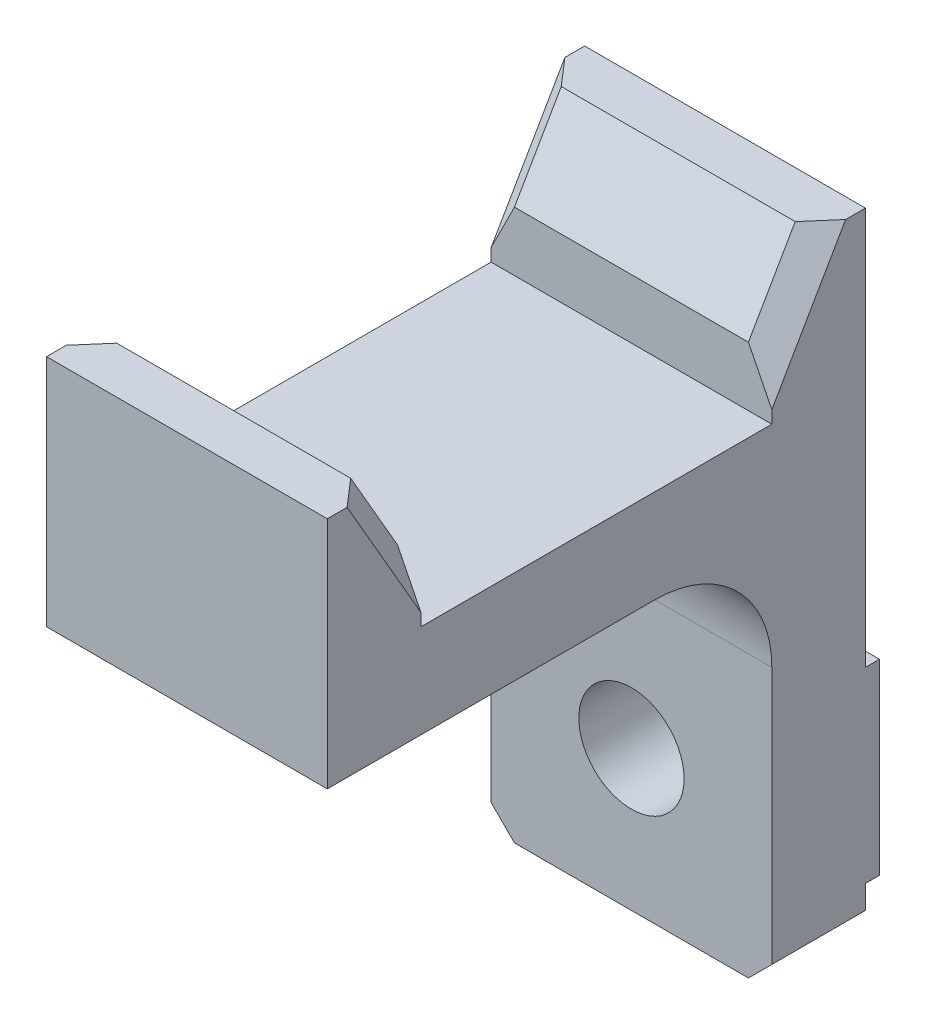
ISO-10303-21;
HEADER;
FILE_DESCRIPTION(('STEP AP214'),'2;1');
FILE_NAME('part.step','',(''),(''),'','','');
FILE_SCHEMA(('AUTOMOTIVE_DESIGN { 1 0 10303 214 1 1 1 1 }'));
ENDSEC;
DATA;
#1=APPLICATION_CONTEXT('core data for automotive mechanical design processes');
#2=APPLICATION_PROTOCOL_DEFINITION('international standard','automotive_design',2000,#1);
#3=PRODUCT_CONTEXT('',#1,'mechanical');
#4=PRODUCT('Part','Part','',(#3));
#5=PRODUCT_RELATED_PRODUCT_CATEGORY('part','',(#4));
#6=PRODUCT_DEFINITION_FORMATION('','',#4);
#7=PRODUCT_DEFINITION_CONTEXT('part definition',#1,'design');
#8=PRODUCT_DEFINITION('design','',#6,#7);
#9=PRODUCT_DEFINITION_SHAPE('','',#8);
#10=(LENGTH_UNIT() NAMED_UNIT(*) SI_UNIT(.MILLI.,.METRE.));
#11=(NAMED_UNIT(*) PLANE_ANGLE_UNIT() SI_UNIT($,.RADIAN.));
#12=(NAMED_UNIT(*) SI_UNIT($,.STERADIAN.) SOLID_ANGLE_UNIT());
#13=UNCERTAINTY_MEASURE_WITH_UNIT(LENGTH_MEASURE(1.E-05),#10,'distance_accuracy_value','');
#14=(GEOMETRIC_REPRESENTATION_CONTEXT(3) GLOBAL_UNCERTAINTY_ASSIGNED_CONTEXT((#13)) GLOBAL_UNIT_ASSIGNED_CONTEXT((#10,
#11,#12)) REPRESENTATION_CONTEXT('',''));
#15=CARTESIAN_POINT('',(0.,0.,0.));
#16=DIRECTION('',(0.,0.,1.));
#17=DIRECTION('',(1.,0.,0.));
#18=AXIS2_PLACEMENT_3D('',#15,#16,#17);
#19=CARTESIAN_POINT('',(6.,0.,7.5));
#20=DIRECTION('',(0.,0.,1.));
#21=DIRECTION('',(1.,0.,0.));
#22=AXIS2_PLACEMENT_3D('',#19,#20,#21);
#23=PLANE('',#22);
#24=DIRECTION('',(0.,1.,0.));
#25=VECTOR('',#24,1.);
#26=CARTESIAN_POINT('',(-6.,0.,7.5));
#27=LINE('',#26,#25);
#28=CARTESIAN_POINT('',(-6.,0.,7.5));
#29=VERTEX_POINT('',#28);
#30=CARTESIAN_POINT('',(-6.,0.535898384862258,7.5));
#31=VERTEX_POINT('',#30);
#32=EDGE_CURVE('E240',#29,#31,#27,.T.);
#33=ORIENTED_EDGE('',*,*,#32,.T.);
#34=DIRECTION('',(0.447213595499961,0.894427190999914,0.));
#35=VECTOR('',#34,1.);
#36=CARTESIAN_POINT('',(-7.45980762113535,-2.3837168574084,7.5));
#37=LINE('',#36,#35);
#38=CARTESIAN_POINT('',(-5.,2.53589838486225,7.5));
#39=VERTEX_POINT('',#38);
#40=EDGE_CURVE('E313',#31,#39,#37,.T.);
#41=ORIENTED_EDGE('',*,*,#40,.T.);
#42=DIRECTION('',(1.,0.,0.));
#43=VECTOR('',#42,1.);
#44=CARTESIAN_POINT('',(6.,2.53589838486225,7.5));
#45=LINE('',#44,#43);
#46=CARTESIAN_POINT('',(4.99999999999999,2.53589838486225,7.5));
#47=VERTEX_POINT('',#46);
#48=EDGE_CURVE('E296',#39,#47,#45,.T.);
#49=ORIENTED_EDGE('',*,*,#48,.T.);
#50=DIRECTION('',(-0.447213595499961,0.894427190999915,0.));
#51=VECTOR('',#50,1.);
#52=CARTESIAN_POINT('',(7.45980762113534,-2.38371685740841,7.5));
#53=LINE('',#52,#51);
#54=CARTESIAN_POINT('',(6.,0.53589838486224,7.5));
#55=VERTEX_POINT('',#54);
#56=EDGE_CURVE('E311',#47,#55,#53,.F.);
#57=ORIENTED_EDGE('',*,*,#56,.T.);
#58=DIRECTION('',(0.,1.,0.));
#59=VECTOR('',#58,1.);
#60=CARTESIAN_POINT('',(6.,0.,7.5));
#61=LINE('',#60,#59);
#62=CARTESIAN_POINT('',(6.,0.,7.5));
#63=VERTEX_POINT('',#62);
#64=EDGE_CURVE('E200',#63,#55,#61,.T.);
#65=ORIENTED_EDGE('',*,*,#64,.F.);
#66=DIRECTION('',(-1.,0.,0.));
#67=VECTOR('',#66,1.);
#68=CARTESIAN_POINT('',(6.,0.,7.5));
#69=LINE('',#68,#67);
#70=EDGE_CURVE('E239',#63,#29,#69,.T.);
#71=ORIENTED_EDGE('',*,*,#70,.T.);
#72=EDGE_LOOP('',(#33,#41,#49,#57,#65,#71));
#73=FACE_BOUND('',#72,.T.);
#74=ADVANCED_FACE('F35',(#73),#23,.F.);
#75=CARTESIAN_POINT('',(6.,6.,11.5));
#76=DIRECTION('',(0.,-1.,0.));
#77=DIRECTION('',(0.,0.,-1.));
#78=AXIS2_PLACEMENT_3D('',#75,#76,#77);
#79=PLANE('',#78);
#80=DIRECTION('',(-1.,0.,0.));
#81=VECTOR('',#80,1.);
#82=CARTESIAN_POINT('',(6.,6.,9.5));
#83=LINE('',#82,#81);
#84=CARTESIAN_POINT('',(4.99999999999999,6.,9.5));
#85=VERTEX_POINT('',#84);
#86=CARTESIAN_POINT('',(-5.,6.,9.5));
#87=VERTEX_POINT('',#86);
#88=EDGE_CURVE('E210',#85,#87,#83,.T.);
#89=ORIENTED_EDGE('',*,*,#88,.T.);
#90=DIRECTION('',(-0.65465367070798,0.,0.755928946018452));
#91=VECTOR('',#90,1.);
#92=CARTESIAN_POINT('',(-3.39610838057825,6.,7.64798548355176));
#93=LINE('',#92,#91);
#94=CARTESIAN_POINT('',(-6.,6.,10.6547005383793));
#95=VERTEX_POINT('',#94);
#96=EDGE_CURVE('E321',#87,#95,#93,.T.);
#97=ORIENTED_EDGE('',*,*,#96,.T.);
#98=DIRECTION('',(0.,0.,1.));
#99=VECTOR('',#98,1.);
#100=CARTESIAN_POINT('',(-6.,6.,11.5));
#101=LINE('',#100,#99);
#102=CARTESIAN_POINT('',(-6.,6.,11.5));
#103=VERTEX_POINT('',#102);
#104=EDGE_CURVE('E207',#95,#103,#101,.T.);
#105=ORIENTED_EDGE('',*,*,#104,.T.);
#106=DIRECTION('',(-1.,0.,0.));
#107=VECTOR('',#106,1.);
#108=CARTESIAN_POINT('',(6.,6.,11.5));
#109=LINE('',#108,#107);
#110=CARTESIAN_POINT('',(6.,6.,11.5));
#111=VERTEX_POINT('',#110);
#112=EDGE_CURVE('E203',#111,#103,#109,.T.);
#113=ORIENTED_EDGE('',*,*,#112,.F.);
#114=DIRECTION('',(0.,0.,1.));
#115=VECTOR('',#114,1.);
#116=CARTESIAN_POINT('',(6.,6.,11.5));
#117=LINE('',#116,#115);
#118=CARTESIAN_POINT('',(6.,6.,10.6547005383793));
#119=VERTEX_POINT('',#118);
#120=EDGE_CURVE('E190',#119,#111,#117,.T.);
#121=ORIENTED_EDGE('',*,*,#120,.F.);
#122=DIRECTION('',(0.654653670707979,0.,0.755928946018453));
#123=VECTOR('',#122,1.);
#124=CARTESIAN_POINT('',(3.39610838057825,6.,7.64798548355176));
#125=LINE('',#124,#123);
#126=EDGE_CURVE('E319',#119,#85,#125,.F.);
#127=ORIENTED_EDGE('',*,*,#126,.T.);
#128=EDGE_LOOP('',(#89,#97,#105,#113,#121,#127));
#129=FACE_BOUND('',#128,.T.);
#130=ADVANCED_FACE('F205',(#129),#79,.F.);
#131=CARTESIAN_POINT('',(6.,6.,11.5));
#132=DIRECTION('',(0.,0.,-1.));
#133=DIRECTION('',(0.,1.,0.));
#134=AXIS2_PLACEMENT_3D('',#131,#132,#133);
#135=PLANE('',#134);
#136=DIRECTION('',(0.,-1.,0.));
#137=VECTOR('',#136,1.);
#138=CARTESIAN_POINT('',(-6.,6.,11.5));
#139=LINE('',#138,#137);
#140=CARTESIAN_POINT('',(-6.,-4.,11.5));
#141=VERTEX_POINT('',#140);
#142=EDGE_CURVE('E245',#103,#141,#139,.T.);
#143=ORIENTED_EDGE('',*,*,#142,.T.);
#144=DIRECTION('',(-1.,0.,0.));
#145=VECTOR('',#144,1.);
#146=CARTESIAN_POINT('',(6.,-4.,11.5));
#147=LINE('',#146,#145);
#148=CARTESIAN_POINT('',(6.,-4.,11.5));
#149=VERTEX_POINT('',#148);
#150=EDGE_CURVE('E211',#149,#141,#147,.T.);
#151=ORIENTED_EDGE('',*,*,#150,.F.);
#152=DIRECTION('',(0.,-1.,0.));
#153=VECTOR('',#152,1.);
#154=CARTESIAN_POINT('',(6.,6.,11.5));
#155=LINE('',#154,#153);
#156=EDGE_CURVE('E194',#111,#149,#155,.T.);
#157=ORIENTED_EDGE('',*,*,#156,.F.);
#158=ORIENTED_EDGE('',*,*,#112,.T.);
#159=EDGE_LOOP('',(#143,#151,#157,#158));
#160=FACE_BOUND('',#159,.T.);
#161=ADVANCED_FACE('F213',(#160),#135,.F.);
#162=CARTESIAN_POINT('',(6.,-4.,11.5));
#163=DIRECTION('',(0.,1.,0.));
#164=DIRECTION('',(0.,0.,1.));
#165=AXIS2_PLACEMENT_3D('',#162,#163,#164);
#166=PLANE('',#165);
#167=DIRECTION('',(0.,0.,-1.));
#168=VECTOR('',#167,1.);
#169=CARTESIAN_POINT('',(-6.,-4.,11.5));
#170=LINE('',#169,#168);
#171=CARTESIAN_POINT('',(-6.,-4.,-2.5));
#172=VERTEX_POINT('',#171);
#173=EDGE_CURVE('E247',#141,#172,#170,.T.);
#174=ORIENTED_EDGE('',*,*,#173,.T.);
#175=DIRECTION('',(-1.,0.,0.));
#176=VECTOR('',#175,1.);
#177=CARTESIAN_POINT('',(6.,-4.,-2.5));
#178=LINE('',#177,#176);
#179=CARTESIAN_POINT('',(6.,-4.,-2.5));
#180=VERTEX_POINT('',#179);
#181=EDGE_CURVE('E50',#172,#180,#178,.F.);
#182=ORIENTED_EDGE('',*,*,#181,.T.);
#183=DIRECTION('',(0.,0.,-1.));
#184=VECTOR('',#183,1.);
#185=CARTESIAN_POINT('',(6.,-4.,11.5));
#186=LINE('',#185,#184);
#187=EDGE_CURVE('E215',#149,#180,#186,.T.);
#188=ORIENTED_EDGE('',*,*,#187,.F.);
#189=ORIENTED_EDGE('',*,*,#150,.T.);
#190=EDGE_LOOP('',(#174,#182,#188,#189));
#191=FACE_BOUND('',#190,.T.);
#192=ADVANCED_FACE('F455',(#191),#166,.F.);
#193=CARTESIAN_POINT('',(6.,-4.,-7.5));
#194=DIRECTION('',(0.,0.,-1.));
#195=DIRECTION('',(0.,1.,0.));
#196=AXIS2_PLACEMENT_3D('',#193,#194,#195);
#197=PLANE('',#196);
#198=CARTESIAN_POINT('',(0.,-15.,-7.5));
#199=DIRECTION('',(0.,0.,1.));
#200=DIRECTION('',(1.,0.,0.));
#201=AXIS2_PLACEMENT_3D('',#198,#199,#200);
#202=CIRCLE('',#201,2.25);
#203=CARTESIAN_POINT('',(2.25,-15.,-7.5));
#204=VERTEX_POINT('',#203);
#205=EDGE_CURVE('E440',#204,#204,#202,.T.);
#206=ORIENTED_EDGE('',*,*,#205,.F.);
#207=EDGE_LOOP('',(#206));
#208=FACE_BOUND('',#207,.T.);
#209=DIRECTION('',(0.,-1.,0.));
#210=VECTOR('',#209,1.);
#211=CARTESIAN_POINT('',(6.,-4.,-7.5));
#212=LINE('',#211,#210);
#213=CARTESIAN_POINT('',(6.,-9.,-7.5));
#214=VERTEX_POINT('',#213);
#215=CARTESIAN_POINT('',(6.,-20.,-7.5));
#216=VERTEX_POINT('',#215);
#217=EDGE_CURVE('E217',#214,#216,#212,.T.);
#218=ORIENTED_EDGE('',*,*,#217,.F.);
#219=DIRECTION('',(-1.,0.,0.));
#220=VECTOR('',#219,1.);
#221=CARTESIAN_POINT('',(-6.,-9.,-7.5));
#222=LINE('',#221,#220);
#223=CARTESIAN_POINT('',(-6.,-9.,-7.5));
#224=VERTEX_POINT('',#223);
#225=EDGE_CURVE('E359',#214,#224,#222,.T.);
#226=ORIENTED_EDGE('',*,*,#225,.T.);
#227=DIRECTION('',(0.,-1.,0.));
#228=VECTOR('',#227,1.);
#229=CARTESIAN_POINT('',(-6.,-4.,-7.5));
#230=LINE('',#229,#228);
#231=CARTESIAN_POINT('',(-6.,-20.,-7.5));
#232=VERTEX_POINT('',#231);
#233=EDGE_CURVE('E249',#224,#232,#230,.T.);
#234=ORIENTED_EDGE('',*,*,#233,.T.);
#235=DIRECTION('',(0.707106781186545,-0.70710678118655,0.));
#236=VECTOR('',#235,1.);
#237=CARTESIAN_POINT('',(-5.,-21.,-7.5));
#238=LINE('',#237,#236);
#239=CARTESIAN_POINT('',(-5.00000000000001,-21.,-7.5));
#240=VERTEX_POINT('',#239);
#241=EDGE_CURVE('E354',#232,#240,#238,.T.);
#242=ORIENTED_EDGE('',*,*,#241,.T.);
#243=DIRECTION('',(-1.,0.,0.));
#244=VECTOR('',#243,1.);
#245=CARTESIAN_POINT('',(6.,-21.,-7.5));
#246=LINE('',#245,#244);
#247=CARTESIAN_POINT('',(5.00000000000001,-21.,-7.5));
#248=VERTEX_POINT('',#247);
#249=EDGE_CURVE('E291',#248,#240,#246,.T.);
#250=ORIENTED_EDGE('',*,*,#249,.F.);
#251=DIRECTION('',(-0.707106781186547,-0.707106781186548,0.));
#252=VECTOR('',#251,1.);
#253=CARTESIAN_POINT('',(6.,-20.,-7.5));
#254=LINE('',#253,#252);
#255=EDGE_CURVE('E351',#248,#216,#254,.F.);
#256=ORIENTED_EDGE('',*,*,#255,.T.);
#257=EDGE_LOOP('',(#218,#226,#234,#242,#250,#256));
#258=FACE_BOUND('',#257,.T.);
#259=ADVANCED_FACE('F365',(#208,#258),#197,.F.);
#260=CARTESIAN_POINT('',(6.,-21.,-11.5));
#261=DIRECTION('',(0.,1.,0.));
#262=DIRECTION('',(0.,0.,1.));
#263=AXIS2_PLACEMENT_3D('',#260,#261,#262);
#264=PLANE('',#263);
#265=ORIENTED_EDGE('',*,*,#249,.T.);
#266=DIRECTION('',(0.,0.,-1.));
#267=VECTOR('',#266,1.);
#268=CARTESIAN_POINT('',(-5.00000000000001,-21.,-11.5));
#269=LINE('',#268,#267);
#270=CARTESIAN_POINT('',(-5.00000000000001,-21.,-11.5));
#271=VERTEX_POINT('',#270);
#272=EDGE_CURVE('E341',#240,#271,#269,.T.);
#273=ORIENTED_EDGE('',*,*,#272,.T.);
#274=DIRECTION('',(-1.,0.,0.));
#275=VECTOR('',#274,1.);
#276=CARTESIAN_POINT('',(6.,-21.,-11.5));
#277=LINE('',#276,#275);
#278=CARTESIAN_POINT('',(5.00000000000001,-21.,-11.5));
#279=VERTEX_POINT('',#278);
#280=EDGE_CURVE('E288',#279,#271,#277,.T.);
#281=ORIENTED_EDGE('',*,*,#280,.F.);
#282=DIRECTION('',(0.,0.,1.));
#283=VECTOR('',#282,1.);
#284=CARTESIAN_POINT('',(5.00000000000001,-21.,-11.5));
#285=LINE('',#284,#283);
#286=EDGE_CURVE('E339',#279,#248,#285,.T.);
#287=ORIENTED_EDGE('',*,*,#286,.T.);
#288=EDGE_LOOP('',(#265,#273,#281,#287));
#289=FACE_BOUND('',#288,.T.);
#290=ADVANCED_FACE('F379',(#289),#264,.F.);
#291=CARTESIAN_POINT('',(6.,-19.,-11.5));
#292=DIRECTION('',(0.,0.,1.));
#293=DIRECTION('',(1.,0.,0.));
#294=AXIS2_PLACEMENT_3D('',#291,#292,#293);
#295=PLANE('',#294);
#296=ORIENTED_EDGE('',*,*,#280,.T.);
#297=DIRECTION('',(-0.707106781186545,0.70710678118655,0.));
#298=VECTOR('',#297,1.);
#299=CARTESIAN_POINT('',(-5.00000000000001,-21.,-11.5));
#300=LINE('',#299,#298);
#301=CARTESIAN_POINT('',(-6.,-20.,-11.5));
#302=VERTEX_POINT('',#301);
#303=EDGE_CURVE('E346',#271,#302,#300,.T.);
#304=ORIENTED_EDGE('',*,*,#303,.T.);
#305=DIRECTION('',(0.,1.,0.));
#306=VECTOR('',#305,1.);
#307=CARTESIAN_POINT('',(-6.,-19.,-11.5));
#308=LINE('',#307,#306);
#309=CARTESIAN_POINT('',(-6.,-19.,-11.5));
#310=VERTEX_POINT('',#309);
#311=EDGE_CURVE('E251',#302,#310,#308,.T.);
#312=ORIENTED_EDGE('',*,*,#311,.T.);
#313=DIRECTION('',(-1.,0.,0.));
#314=VECTOR('',#313,1.);
#315=CARTESIAN_POINT('',(6.,-19.,-11.5));
#316=LINE('',#315,#314);
#317=CARTESIAN_POINT('',(6.,-19.,-11.5));
#318=VERTEX_POINT('',#317);
#319=EDGE_CURVE('E285',#318,#310,#316,.T.);
#320=ORIENTED_EDGE('',*,*,#319,.F.);
#321=DIRECTION('',(0.,1.,0.));
#322=VECTOR('',#321,1.);
#323=CARTESIAN_POINT('',(6.,-19.,-11.5));
#324=LINE('',#323,#322);
#325=CARTESIAN_POINT('',(6.,-20.,-11.5));
#326=VERTEX_POINT('',#325);
#327=EDGE_CURVE('E222',#326,#318,#324,.T.);
#328=ORIENTED_EDGE('',*,*,#327,.F.);
#329=DIRECTION('',(0.707106781186547,0.707106781186548,0.));
#330=VECTOR('',#329,1.);
#331=CARTESIAN_POINT('',(6.00000000000001,-20.,-11.5));
#332=LINE('',#331,#330);
#333=EDGE_CURVE('E344',#326,#279,#332,.F.);
#334=ORIENTED_EDGE('',*,*,#333,.T.);
#335=EDGE_LOOP('',(#296,#304,#312,#320,#328,#334));
#336=FACE_BOUND('',#335,.T.);
#337=ADVANCED_FACE('F388',(#336),#295,.F.);
#338=CARTESIAN_POINT('',(6.,-19.,-11.5));
#339=DIRECTION('',(0.,1.,0.));
#340=DIRECTION('',(0.,0.,1.));
#341=AXIS2_PLACEMENT_3D('',#338,#339,#340);
#342=PLANE('',#341);
#343=DIRECTION('',(0.,0.,-1.));
#344=VECTOR('',#343,1.);
#345=CARTESIAN_POINT('',(-6.,-19.,-11.5));
#346=LINE('',#345,#344);
#347=CARTESIAN_POINT('',(-6.,-19.,-12.1));
#348=VERTEX_POINT('',#347);
#349=EDGE_CURVE('E253',#310,#348,#346,.T.);
#350=ORIENTED_EDGE('',*,*,#349,.T.);
#351=DIRECTION('',(-1.,0.,0.));
#352=VECTOR('',#351,1.);
#353=CARTESIAN_POINT('',(6.,-19.,-12.1));
#354=LINE('',#353,#352);
#355=CARTESIAN_POINT('',(6.,-19.,-12.1));
#356=VERTEX_POINT('',#355);
#357=EDGE_CURVE('E282',#356,#348,#354,.T.);
#358=ORIENTED_EDGE('',*,*,#357,.F.);
#359=DIRECTION('',(0.,0.,-1.));
#360=VECTOR('',#359,1.);
#361=CARTESIAN_POINT('',(6.,-19.,-11.5));
#362=LINE('',#361,#360);
#363=EDGE_CURVE('E224',#318,#356,#362,.T.);
#364=ORIENTED_EDGE('',*,*,#363,.F.);
#365=ORIENTED_EDGE('',*,*,#319,.T.);
#366=EDGE_LOOP('',(#350,#358,#364,#365));
#367=FACE_BOUND('',#366,.T.);
#368=ADVANCED_FACE('F392',(#367),#342,.F.);
#369=CARTESIAN_POINT('',(6.,-11.,-12.1));
#370=DIRECTION('',(0.,0.,1.));
#371=DIRECTION('',(1.,0.,0.));
#372=AXIS2_PLACEMENT_3D('',#369,#370,#371);
#373=PLANE('',#372);
#374=CARTESIAN_POINT('',(0.,-15.,-12.1));
#375=DIRECTION('',(0.,0.,1.));
#376=DIRECTION('',(1.,0.,0.));
#377=AXIS2_PLACEMENT_3D('',#374,#375,#376);
#378=CIRCLE('',#377,2.25);
#379=CARTESIAN_POINT('',(2.25,-15.,-12.1));
#380=VERTEX_POINT('',#379);
#381=EDGE_CURVE('E243',#380,#380,#378,.T.);
#382=ORIENTED_EDGE('',*,*,#381,.T.);
#383=EDGE_LOOP('',(#382));
#384=FACE_BOUND('',#383,.T.);
#385=DIRECTION('',(0.,1.,0.));
#386=VECTOR('',#385,1.);
#387=CARTESIAN_POINT('',(-6.,-11.,-12.1));
#388=LINE('',#387,#386);
#389=CARTESIAN_POINT('',(-6.,-11.,-12.1));
#390=VERTEX_POINT('',#389);
#391=EDGE_CURVE('E255',#348,#390,#388,.T.);
#392=ORIENTED_EDGE('',*,*,#391,.T.);
#393=DIRECTION('',(-1.,0.,0.));
#394=VECTOR('',#393,1.);
#395=CARTESIAN_POINT('',(6.,-11.,-12.1));
#396=LINE('',#395,#394);
#397=CARTESIAN_POINT('',(6.,-11.,-12.1));
#398=VERTEX_POINT('',#397);
#399=EDGE_CURVE('E279',#398,#390,#396,.T.);
#400=ORIENTED_EDGE('',*,*,#399,.F.);
#401=DIRECTION('',(0.,1.,0.));
#402=VECTOR('',#401,1.);
#403=CARTESIAN_POINT('',(6.,-11.,-12.1));
#404=LINE('',#403,#402);
#405=EDGE_CURVE('E226',#356,#398,#404,.T.);
#406=ORIENTED_EDGE('',*,*,#405,.F.);
#407=ORIENTED_EDGE('',*,*,#357,.T.);
#408=EDGE_LOOP('',(#392,#400,#406,#407));
#409=FACE_BOUND('',#408,.T.);
#410=ADVANCED_FACE('F398',(#384,#409),#373,.F.);
#411=CARTESIAN_POINT('',(6.,-11.,-11.5));
#412=DIRECTION('',(0.,-1.,0.));
#413=DIRECTION('',(0.,0.,-1.));
#414=AXIS2_PLACEMENT_3D('',#411,#412,#413);
#415=PLANE('',#414);
#416=DIRECTION('',(0.,0.,1.));
#417=VECTOR('',#416,1.);
#418=CARTESIAN_POINT('',(-6.,-11.,-11.5));
#419=LINE('',#418,#417);
#420=CARTESIAN_POINT('',(-6.,-11.,-11.5));
#421=VERTEX_POINT('',#420);
#422=EDGE_CURVE('E257',#390,#421,#419,.T.);
#423=ORIENTED_EDGE('',*,*,#422,.T.);
#424=DIRECTION('',(-1.,0.,0.));
#425=VECTOR('',#424,1.);
#426=CARTESIAN_POINT('',(6.,-11.,-11.5));
#427=LINE('',#426,#425);
#428=CARTESIAN_POINT('',(6.,-11.,-11.5));
#429=VERTEX_POINT('',#428);
#430=EDGE_CURVE('E276',#429,#421,#427,.T.);
#431=ORIENTED_EDGE('',*,*,#430,.F.);
#432=DIRECTION('',(0.,0.,1.));
#433=VECTOR('',#432,1.);
#434=CARTESIAN_POINT('',(6.,-11.,-11.5));
#435=LINE('',#434,#433);
#436=EDGE_CURVE('E228',#398,#429,#435,.T.);
#437=ORIENTED_EDGE('',*,*,#436,.F.);
#438=ORIENTED_EDGE('',*,*,#399,.T.);
#439=EDGE_LOOP('',(#423,#431,#437,#438));
#440=FACE_BOUND('',#439,.T.);
#441=ADVANCED_FACE('F402',(#440),#415,.F.);
#442=CARTESIAN_POINT('',(6.,6.,-11.5));
#443=DIRECTION('',(0.,0.,1.));
#444=DIRECTION('',(0.,-1.,0.));
#445=AXIS2_PLACEMENT_3D('',#442,#443,#444);
#446=PLANE('',#445);
#447=DIRECTION('',(0.,1.,0.));
#448=VECTOR('',#447,1.);
#449=CARTESIAN_POINT('',(-6.,6.,-11.5));
#450=LINE('',#449,#448);
#451=CARTESIAN_POINT('',(-6.,6.,-11.5));
#452=VERTEX_POINT('',#451);
#453=EDGE_CURVE('E259',#421,#452,#450,.T.);
#454=ORIENTED_EDGE('',*,*,#453,.T.);
#455=DIRECTION('',(-1.,0.,0.));
#456=VECTOR('',#455,1.);
#457=CARTESIAN_POINT('',(6.,6.,-11.5));
#458=LINE('',#457,#456);
#459=CARTESIAN_POINT('',(6.,6.,-11.5));
#460=VERTEX_POINT('',#459);
#461=EDGE_CURVE('E273',#460,#452,#458,.T.);
#462=ORIENTED_EDGE('',*,*,#461,.F.);
#463=DIRECTION('',(0.,1.,0.));
#464=VECTOR('',#463,1.);
#465=CARTESIAN_POINT('',(6.,6.,-11.5));
#466=LINE('',#465,#464);
#467=EDGE_CURVE('E230',#429,#460,#466,.T.);
#468=ORIENTED_EDGE('',*,*,#467,.F.);
#469=ORIENTED_EDGE('',*,*,#430,.T.);
#470=EDGE_LOOP('',(#454,#462,#468,#469));
#471=FACE_BOUND('',#470,.T.);
#472=ADVANCED_FACE('F407',(#471),#446,.F.);
#473=CARTESIAN_POINT('',(6.,6.,-7.5));
#474=DIRECTION('',(0.,-1.,0.));
#475=DIRECTION('',(0.,0.,-1.));
#476=AXIS2_PLACEMENT_3D('',#473,#474,#475);
#477=PLANE('',#476);
#478=DIRECTION('',(0.,0.,1.));
#479=VECTOR('',#478,1.);
#480=CARTESIAN_POINT('',(-6.,6.,-7.5));
#481=LINE('',#480,#479);
#482=CARTESIAN_POINT('',(-6.,6.,-10.6547005383793));
#483=VERTEX_POINT('',#482);
#484=EDGE_CURVE('E261',#452,#483,#481,.T.);
#485=ORIENTED_EDGE('',*,*,#484,.T.);
#486=DIRECTION('',(0.654653670707979,0.,0.755928946018453));
#487=VECTOR('',#486,1.);
#488=CARTESIAN_POINT('',(-3.39610838057825,6.,-7.64798548355175));
#489=LINE('',#488,#487);
#490=CARTESIAN_POINT('',(-5.,6.,-9.5));
#491=VERTEX_POINT('',#490);
#492=EDGE_CURVE('E329',#483,#491,#489,.T.);
#493=ORIENTED_EDGE('',*,*,#492,.T.);
#494=DIRECTION('',(1.,0.,0.));
#495=VECTOR('',#494,1.);
#496=CARTESIAN_POINT('',(6.,6.,-9.5));
#497=LINE('',#496,#495);
#498=CARTESIAN_POINT('',(5.,6.,-9.5));
#499=VERTEX_POINT('',#498);
#500=EDGE_CURVE('E302',#491,#499,#497,.T.);
#501=ORIENTED_EDGE('',*,*,#500,.T.);
#502=DIRECTION('',(-0.654653670707979,0.,0.755928946018453));
#503=VECTOR('',#502,1.);
#504=CARTESIAN_POINT('',(3.39610838057825,6.,-7.64798548355175));
#505=LINE('',#504,#503);
#506=CARTESIAN_POINT('',(6.,6.,-10.6547005383793));
#507=VERTEX_POINT('',#506);
#508=EDGE_CURVE('E327',#499,#507,#505,.F.);
#509=ORIENTED_EDGE('',*,*,#508,.T.);
#510=DIRECTION('',(0.,0.,1.));
#511=VECTOR('',#510,1.);
#512=CARTESIAN_POINT('',(6.,6.,-7.5));
#513=LINE('',#512,#511);
#514=EDGE_CURVE('E232',#460,#507,#513,.T.);
#515=ORIENTED_EDGE('',*,*,#514,.F.);
#516=ORIENTED_EDGE('',*,*,#461,.T.);
#517=EDGE_LOOP('',(#485,#493,#501,#509,#515,#516));
#518=FACE_BOUND('',#517,.T.);
#519=ADVANCED_FACE('F603',(#518),#477,.F.);
#520=CARTESIAN_POINT('',(6.,0.,-7.5));
#521=DIRECTION('',(0.,0.,-1.));
#522=DIRECTION('',(-1.,0.,0.));
#523=AXIS2_PLACEMENT_3D('',#520,#521,#522);
#524=PLANE('',#523);
#525=DIRECTION('',(-1.,0.,0.));
#526=VECTOR('',#525,1.);
#527=CARTESIAN_POINT('',(6.,2.53589838486225,-7.5));
#528=LINE('',#527,#526);
#529=CARTESIAN_POINT('',(5.,2.53589838486225,-7.5));
#530=VERTEX_POINT('',#529);
#531=CARTESIAN_POINT('',(-5.,2.53589838486225,-7.5));
#532=VERTEX_POINT('',#531);
#533=EDGE_CURVE('E299',#530,#532,#528,.T.);
#534=ORIENTED_EDGE('',*,*,#533,.T.);
#535=DIRECTION('',(-0.44721359549996,-0.894427190999915,0.));
#536=VECTOR('',#535,1.);
#537=CARTESIAN_POINT('',(-7.45980762113534,-2.38371685740841,-7.5));
#538=LINE('',#537,#536);
#539=CARTESIAN_POINT('',(-6.,0.535898384862253,-7.5));
#540=VERTEX_POINT('',#539);
#541=EDGE_CURVE('E337',#532,#540,#538,.T.);
#542=ORIENTED_EDGE('',*,*,#541,.T.);
#543=DIRECTION('',(0.,-1.,0.));
#544=VECTOR('',#543,1.);
#545=CARTESIAN_POINT('',(-6.,0.,-7.5));
#546=LINE('',#545,#544);
#547=CARTESIAN_POINT('',(-6.,0.,-7.5));
#548=VERTEX_POINT('',#547);
#549=EDGE_CURVE('E264',#540,#548,#546,.T.);
#550=ORIENTED_EDGE('',*,*,#549,.T.);
#551=DIRECTION('',(-1.,0.,0.));
#552=VECTOR('',#551,1.);
#553=CARTESIAN_POINT('',(6.,0.,-7.5));
#554=LINE('',#553,#552);
#555=CARTESIAN_POINT('',(6.,0.,-7.5));
#556=VERTEX_POINT('',#555);
#557=EDGE_CURVE('E270',#556,#548,#554,.T.);
#558=ORIENTED_EDGE('',*,*,#557,.F.);
#559=DIRECTION('',(0.,-1.,0.));
#560=VECTOR('',#559,1.);
#561=CARTESIAN_POINT('',(6.,0.,-7.5));
#562=LINE('',#561,#560);
#563=CARTESIAN_POINT('',(6.,0.535898384862253,-7.5));
#564=VERTEX_POINT('',#563);
#565=EDGE_CURVE('E235',#564,#556,#562,.T.);
#566=ORIENTED_EDGE('',*,*,#565,.F.);
#567=DIRECTION('',(0.44721359549996,-0.894427190999915,0.));
#568=VECTOR('',#567,1.);
#569=CARTESIAN_POINT('',(7.45980762113534,-2.38371685740841,-7.5));
#570=LINE('',#569,#568);
#571=EDGE_CURVE('E335',#564,#530,#570,.F.);
#572=ORIENTED_EDGE('',*,*,#571,.T.);
#573=EDGE_LOOP('',(#534,#542,#550,#558,#566,#572));
#574=FACE_BOUND('',#573,.T.);
#575=ADVANCED_FACE('F418',(#574),#524,.F.);
#576=CARTESIAN_POINT('',(6.,0.,7.5));
#577=DIRECTION('',(0.,-1.,0.));
#578=DIRECTION('',(0.,0.,-1.));
#579=AXIS2_PLACEMENT_3D('',#576,#577,#578);
#580=PLANE('',#579);
#581=DIRECTION('',(0.,0.,1.));
#582=VECTOR('',#581,1.);
#583=CARTESIAN_POINT('',(-6.,0.,7.5));
#584=LINE('',#583,#582);
#585=EDGE_CURVE('E266',#548,#29,#584,.T.);
#586=ORIENTED_EDGE('',*,*,#585,.T.);
#587=ORIENTED_EDGE('',*,*,#70,.F.);
#588=DIRECTION('',(0.,0.,1.));
#589=VECTOR('',#588,1.);
#590=CARTESIAN_POINT('',(6.,0.,7.5));
#591=LINE('',#590,#589);
#592=EDGE_CURVE('E237',#556,#63,#591,.T.);
#593=ORIENTED_EDGE('',*,*,#592,.F.);
#594=ORIENTED_EDGE('',*,*,#557,.T.);
#595=EDGE_LOOP('',(#586,#587,#593,#594));
#596=FACE_BOUND('',#595,.T.);
#597=ADVANCED_FACE('F434',(#596),#580,.F.);
#598=CARTESIAN_POINT('',(6.,0.,0.));
#599=DIRECTION('',(-1.,0.,0.));
#600=DIRECTION('',(0.,0.,1.));
#601=AXIS2_PLACEMENT_3D('',#598,#599,#600);
#602=PLANE('',#601);
#603=ORIENTED_EDGE('',*,*,#187,.T.);
#604=CARTESIAN_POINT('',(6.,-9.,-2.5));
#605=DIRECTION('',(-1.,0.,0.));
#606=DIRECTION('',(0.,0.,1.));
#607=AXIS2_PLACEMENT_3D('',#604,#605,#606);
#608=CIRCLE('',#607,5.);
#609=EDGE_CURVE('E11',#180,#214,#608,.T.);
#610=ORIENTED_EDGE('',*,*,#609,.T.);
#611=ORIENTED_EDGE('',*,*,#217,.T.);
#612=DIRECTION('',(0.,0.,-1.));
#613=VECTOR('',#612,1.);
#614=CARTESIAN_POINT('',(6.,-20.,0.));
#615=LINE('',#614,#613);
#616=EDGE_CURVE('E356',#216,#326,#615,.T.);
#617=ORIENTED_EDGE('',*,*,#616,.T.);
#618=ORIENTED_EDGE('',*,*,#327,.T.);
#619=ORIENTED_EDGE('',*,*,#363,.T.);
#620=ORIENTED_EDGE('',*,*,#405,.T.);
#621=ORIENTED_EDGE('',*,*,#436,.T.);
#622=ORIENTED_EDGE('',*,*,#467,.T.);
#623=ORIENTED_EDGE('',*,*,#514,.T.);
#624=DIRECTION('',(0.,-0.866025403784438,0.500000000000001));
#625=VECTOR('',#624,1.);
#626=CARTESIAN_POINT('',(6.,2.03589838486225,-8.36602540378444));
#627=LINE('',#626,#625);
#628=EDGE_CURVE('E323',#507,#564,#627,.T.);
#629=ORIENTED_EDGE('',*,*,#628,.T.);
#630=ORIENTED_EDGE('',*,*,#565,.T.);
#631=ORIENTED_EDGE('',*,*,#592,.T.);
#632=ORIENTED_EDGE('',*,*,#64,.T.);
#633=DIRECTION('',(0.,0.866025403784438,0.500000000000001));
#634=VECTOR('',#633,1.);
#635=CARTESIAN_POINT('',(6.,5.5,10.3660254037844));
#636=LINE('',#635,#634);
#637=EDGE_CURVE('E198',#55,#119,#636,.T.);
#638=ORIENTED_EDGE('',*,*,#637,.T.);
#639=ORIENTED_EDGE('',*,*,#120,.T.);
#640=ORIENTED_EDGE('',*,*,#156,.T.);
#641=EDGE_LOOP('',(#603,#610,#611,#617,#618,#619,#620,#621,#622,#623,#629,#630,#631,#632,#638,
#639,#640));
#642=FACE_BOUND('',#641,.T.);
#643=ADVANCED_FACE('F192',(#642),#602,.F.);
#644=CARTESIAN_POINT('',(-6.,0.,0.));
#645=DIRECTION('',(-1.,0.,0.));
#646=DIRECTION('',(0.,0.,1.));
#647=AXIS2_PLACEMENT_3D('',#644,#645,#646);
#648=PLANE('',#647);
#649=ORIENTED_EDGE('',*,*,#311,.F.);
#650=DIRECTION('',(0.,0.,1.));
#651=VECTOR('',#650,1.);
#652=CARTESIAN_POINT('',(-6.,-20.,-7.5));
#653=LINE('',#652,#651);
#654=EDGE_CURVE('E348',#302,#232,#653,.T.);
#655=ORIENTED_EDGE('',*,*,#654,.T.);
#656=ORIENTED_EDGE('',*,*,#233,.F.);
#657=CARTESIAN_POINT('',(-6.,-9.,-2.5));
#658=DIRECTION('',(-1.,0.,0.));
#659=DIRECTION('',(0.,0.,1.));
#660=AXIS2_PLACEMENT_3D('',#657,#658,#659);
#661=CIRCLE('',#660,5.);
#662=EDGE_CURVE('E43',#224,#172,#661,.F.);
#663=ORIENTED_EDGE('',*,*,#662,.T.);
#664=ORIENTED_EDGE('',*,*,#173,.F.);
#665=ORIENTED_EDGE('',*,*,#142,.F.);
#666=ORIENTED_EDGE('',*,*,#104,.F.);
#667=DIRECTION('',(0.,-0.866025403784438,-0.500000000000001));
#668=VECTOR('',#667,1.);
#669=CARTESIAN_POINT('',(-6.,-3.11362066797608,5.39294919243111));
#670=LINE('',#669,#668);
#671=EDGE_CURVE('E308',#95,#31,#670,.T.);
#672=ORIENTED_EDGE('',*,*,#671,.T.);
#673=ORIENTED_EDGE('',*,*,#32,.F.);
#674=ORIENTED_EDGE('',*,*,#585,.F.);
#675=ORIENTED_EDGE('',*,*,#549,.F.);
#676=DIRECTION('',(0.,0.866025403784438,-0.500000000000001));
#677=VECTOR('',#676,1.);
#678=CARTESIAN_POINT('',(-6.,-3.11362066797608,-5.39294919243111));
#679=LINE('',#678,#677);
#680=EDGE_CURVE('E305',#540,#483,#679,.T.);
#681=ORIENTED_EDGE('',*,*,#680,.T.);
#682=ORIENTED_EDGE('',*,*,#484,.F.);
#683=ORIENTED_EDGE('',*,*,#453,.F.);
#684=ORIENTED_EDGE('',*,*,#422,.F.);
#685=ORIENTED_EDGE('',*,*,#391,.F.);
#686=ORIENTED_EDGE('',*,*,#349,.F.);
#687=EDGE_LOOP('',(#649,#655,#656,#663,#664,#665,#666,#672,#673,#674,#675,#681,#682,#683,#684,
#685,#686));
#688=FACE_BOUND('',#687,.T.);
#689=ADVANCED_FACE('F369',(#688),#648,.T.);
#690=CARTESIAN_POINT('',(0.,-15.,-12.1));
#691=DIRECTION('',(0.,0.,1.));
#692=DIRECTION('',(1.,0.,0.));
#693=AXIS2_PLACEMENT_3D('',#690,#691,#692);
#694=CYLINDRICAL_SURFACE('',#693,2.25);
#695=ORIENTED_EDGE('',*,*,#381,.F.);
#696=EDGE_LOOP('',(#695));
#697=FACE_BOUND('',#696,.T.);
#698=ORIENTED_EDGE('',*,*,#205,.T.);
#699=EDGE_LOOP('',(#698));
#700=FACE_BOUND('',#699,.T.);
#701=ADVANCED_FACE('F447',(#697,#700),#694,.F.);
#702=CARTESIAN_POINT('',(6.,6.,9.5));
#703=DIRECTION('',(0.,-0.500000000000001,0.866025403784438));
#704=DIRECTION('',(-1.,0.,0.));
#705=AXIS2_PLACEMENT_3D('',#702,#703,#704);
#706=PLANE('',#705);
#707=ORIENTED_EDGE('',*,*,#48,.F.);
#708=DIRECTION('',(0.,-0.866025403784438,-0.500000000000001));
#709=VECTOR('',#708,1.);
#710=CARTESIAN_POINT('',(-5.,6.,9.5));
#711=LINE('',#710,#709);
#712=EDGE_CURVE('E317',#39,#87,#711,.F.);
#713=ORIENTED_EDGE('',*,*,#712,.T.);
#714=ORIENTED_EDGE('',*,*,#88,.F.);
#715=DIRECTION('',(0.,0.866025403784438,0.500000000000001));
#716=VECTOR('',#715,1.);
#717=CARTESIAN_POINT('',(4.99999999999999,2.53589838486225,7.5));
#718=LINE('',#717,#716);
#719=EDGE_CURVE('E315',#85,#47,#718,.F.);
#720=ORIENTED_EDGE('',*,*,#719,.T.);
#721=EDGE_LOOP('',(#707,#713,#714,#720));
#722=FACE_BOUND('',#721,.T.);
#723=ADVANCED_FACE('F450',(#722),#706,.F.);
#724=CARTESIAN_POINT('',(6.,2.53589838486225,-7.5));
#725=DIRECTION('',(0.,-0.500000000000001,-0.866025403784438));
#726=DIRECTION('',(-1.,0.,0.));
#727=AXIS2_PLACEMENT_3D('',#724,#725,#726);
#728=PLANE('',#727);
#729=ORIENTED_EDGE('',*,*,#500,.F.);
#730=DIRECTION('',(0.,0.866025403784438,-0.500000000000001));
#731=VECTOR('',#730,1.);
#732=CARTESIAN_POINT('',(-5.,2.53589838486225,-7.5));
#733=LINE('',#732,#731);
#734=EDGE_CURVE('E333',#491,#532,#733,.F.);
#735=ORIENTED_EDGE('',*,*,#734,.T.);
#736=ORIENTED_EDGE('',*,*,#533,.F.);
#737=DIRECTION('',(0.,-0.866025403784438,0.500000000000001));
#738=VECTOR('',#737,1.);
#739=CARTESIAN_POINT('',(5.,6.,-9.5));
#740=LINE('',#739,#738);
#741=EDGE_CURVE('E331',#530,#499,#740,.F.);
#742=ORIENTED_EDGE('',*,*,#741,.T.);
#743=EDGE_LOOP('',(#729,#735,#736,#742));
#744=FACE_BOUND('',#743,.T.);
#745=ADVANCED_FACE('F423',(#744),#728,.F.);
#746=CARTESIAN_POINT('',(-6.,-3.11362066797608,5.39294919243111));
#747=DIRECTION('',(-0.707106781186545,0.353553390593276,-0.612372435695796));
#748=DIRECTION('',(0.,0.866025403784438,0.500000000000001));
#749=AXIS2_PLACEMENT_3D('',#746,#747,#748);
#750=PLANE('',#749);
#751=ORIENTED_EDGE('',*,*,#96,.F.);
#752=ORIENTED_EDGE('',*,*,#712,.F.);
#753=ORIENTED_EDGE('',*,*,#40,.F.);
#754=ORIENTED_EDGE('',*,*,#671,.F.);
#755=EDGE_LOOP('',(#751,#752,#753,#754));
#756=FACE_BOUND('',#755,.T.);
#757=ADVANCED_FACE('F476',(#756),#750,.T.);
#758=CARTESIAN_POINT('',(6.,-3.11362066797609,5.39294919243112));
#759=DIRECTION('',(-0.707106781186545,-0.353553390593275,0.612372435695796));
#760=DIRECTION('',(0.,0.866025403784438,0.500000000000001));
#761=AXIS2_PLACEMENT_3D('',#758,#759,#760);
#762=PLANE('',#761);
#763=ORIENTED_EDGE('',*,*,#56,.F.);
#764=ORIENTED_EDGE('',*,*,#719,.F.);
#765=ORIENTED_EDGE('',*,*,#126,.F.);
#766=ORIENTED_EDGE('',*,*,#637,.F.);
#767=EDGE_LOOP('',(#763,#764,#765,#766));
#768=FACE_BOUND('',#767,.T.);
#769=ADVANCED_FACE('F479',(#768),#762,.F.);
#770=CARTESIAN_POINT('',(-6.,-3.11362066797608,-5.39294919243111));
#771=DIRECTION('',(-0.707106781186546,0.353553390593275,0.612372435695796));
#772=DIRECTION('',(0.,-0.866025403784438,0.500000000000001));
#773=AXIS2_PLACEMENT_3D('',#770,#771,#772);
#774=PLANE('',#773);
#775=ORIENTED_EDGE('',*,*,#541,.F.);
#776=ORIENTED_EDGE('',*,*,#734,.F.);
#777=ORIENTED_EDGE('',*,*,#492,.F.);
#778=ORIENTED_EDGE('',*,*,#680,.F.);
#779=EDGE_LOOP('',(#775,#776,#777,#778));
#780=FACE_BOUND('',#779,.T.);
#781=ADVANCED_FACE('F426',(#780),#774,.T.);
#782=CARTESIAN_POINT('',(6.,-3.11362066797608,-5.39294919243111));
#783=DIRECTION('',(-0.707106781186546,-0.353553390593275,-0.612372435695796));
#784=DIRECTION('',(0.,-0.866025403784438,0.500000000000001));
#785=AXIS2_PLACEMENT_3D('',#782,#783,#784);
#786=PLANE('',#785);
#787=ORIENTED_EDGE('',*,*,#508,.F.);
#788=ORIENTED_EDGE('',*,*,#741,.F.);
#789=ORIENTED_EDGE('',*,*,#571,.F.);
#790=ORIENTED_EDGE('',*,*,#628,.F.);
#791=EDGE_LOOP('',(#787,#788,#789,#790));
#792=FACE_BOUND('',#791,.T.);
#793=ADVANCED_FACE('F414',(#792),#786,.F.);
#794=CARTESIAN_POINT('',(-5.00000000000001,-21.,-11.5));
#795=DIRECTION('',(-0.70710678118655,-0.707106781186545,0.));
#796=DIRECTION('',(0.,0.,1.));
#797=AXIS2_PLACEMENT_3D('',#794,#795,#796);
#798=PLANE('',#797);
#799=ORIENTED_EDGE('',*,*,#241,.F.);
#800=ORIENTED_EDGE('',*,*,#654,.F.);
#801=ORIENTED_EDGE('',*,*,#303,.F.);
#802=ORIENTED_EDGE('',*,*,#272,.F.);
#803=EDGE_LOOP('',(#799,#800,#801,#802));
#804=FACE_BOUND('',#803,.T.);
#805=ADVANCED_FACE('F375',(#804),#798,.T.);
#806=CARTESIAN_POINT('',(6.,-20.,0.));
#807=DIRECTION('',(-0.707106781186548,0.707106781186547,0.));
#808=DIRECTION('',(0.,0.,-1.));
#809=AXIS2_PLACEMENT_3D('',#806,#807,#808);
#810=PLANE('',#809);
#811=ORIENTED_EDGE('',*,*,#255,.F.);
#812=ORIENTED_EDGE('',*,*,#286,.F.);
#813=ORIENTED_EDGE('',*,*,#333,.F.);
#814=ORIENTED_EDGE('',*,*,#616,.F.);
#815=EDGE_LOOP('',(#811,#812,#813,#814));
#816=FACE_BOUND('',#815,.T.);
#817=ADVANCED_FACE('F383',(#816),#810,.F.);
#818=CARTESIAN_POINT('',(6.,-9.,-2.5));
#819=DIRECTION('',(1.,0.,0.));
#820=DIRECTION('',(0.,0.,-1.));
#821=AXIS2_PLACEMENT_3D('',#818,#819,#820);
#822=CYLINDRICAL_SURFACE('',#821,5.);
#823=ORIENTED_EDGE('',*,*,#609,.F.);
#824=ORIENTED_EDGE('',*,*,#181,.F.);
#825=ORIENTED_EDGE('',*,*,#662,.F.);
#826=ORIENTED_EDGE('',*,*,#225,.F.);
#827=EDGE_LOOP('',(#823,#824,#825,#826));
#828=FACE_BOUND('',#827,.T.);
#829=ADVANCED_FACE('F37',(#828),#822,.F.);
#830=CLOSED_SHELL('',(#74,#130,#161,#192,#259,#290,#337,#368,#410,#441,#472,#519,#575,#597,#643,
#689,#701,#723,#745,#757,#769,#781,#793,#805,#817,#829));
#831=MANIFOLD_SOLID_BREP('B2',#830);
#832=ADVANCED_BREP_SHAPE_REPRESENTATION('',(#18,#831),#14);
#833=SHAPE_DEFINITION_REPRESENTATION(#9,#832);
ENDSEC;
END-ISO-10303-21;
